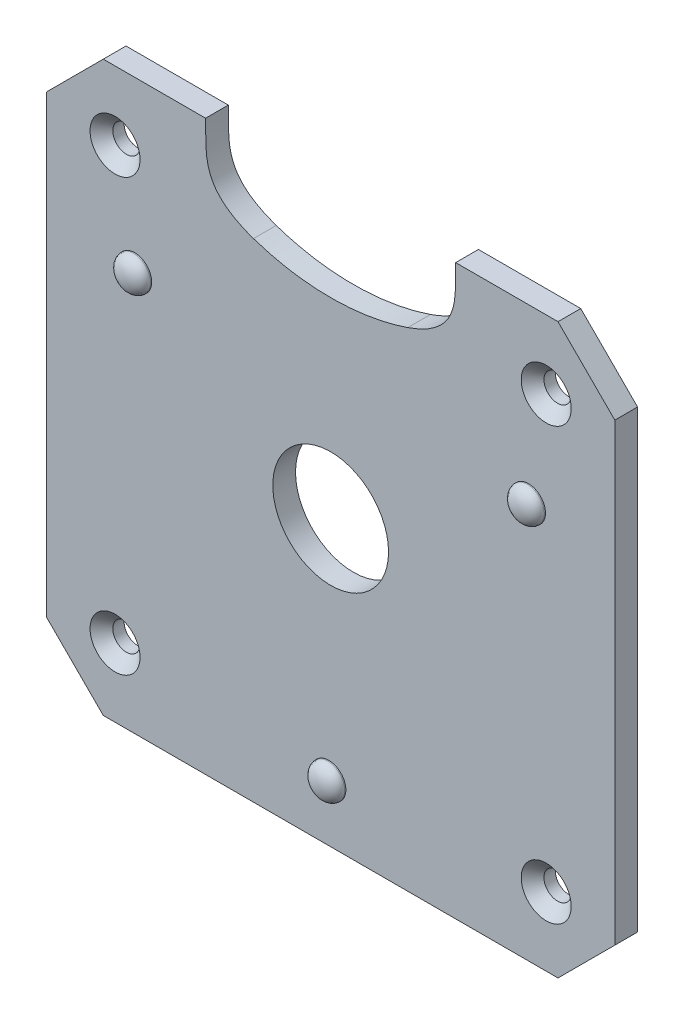
ISO-10303-21;
HEADER;
FILE_DESCRIPTION(('STEP AP214'),'2;1');
FILE_NAME('part.step','',(''),(''),'','','');
FILE_SCHEMA(('AUTOMOTIVE_DESIGN { 1 0 10303 214 1 1 1 1 }'));
ENDSEC;
DATA;
#1=APPLICATION_CONTEXT('core data for automotive mechanical design processes');
#2=APPLICATION_PROTOCOL_DEFINITION('international standard','automotive_design',2000,#1);
#3=PRODUCT_CONTEXT('',#1,'mechanical');
#4=PRODUCT('Part','Part','',(#3));
#5=PRODUCT_RELATED_PRODUCT_CATEGORY('part','',(#4));
#6=PRODUCT_DEFINITION_FORMATION('','',#4);
#7=PRODUCT_DEFINITION_CONTEXT('part definition',#1,'design');
#8=PRODUCT_DEFINITION('design','',#6,#7);
#9=PRODUCT_DEFINITION_SHAPE('','',#8);
#10=(LENGTH_UNIT() NAMED_UNIT(*) SI_UNIT(.MILLI.,.METRE.));
#11=(NAMED_UNIT(*) PLANE_ANGLE_UNIT() SI_UNIT($,.RADIAN.));
#12=(NAMED_UNIT(*) SI_UNIT($,.STERADIAN.) SOLID_ANGLE_UNIT());
#13=UNCERTAINTY_MEASURE_WITH_UNIT(LENGTH_MEASURE(1.E-05),#10,'distance_accuracy_value','');
#14=(GEOMETRIC_REPRESENTATION_CONTEXT(3) GLOBAL_UNCERTAINTY_ASSIGNED_CONTEXT((#13)) GLOBAL_UNIT_ASSIGNED_CONTEXT((#10,
#11,#12)) REPRESENTATION_CONTEXT('',''));
#15=CARTESIAN_POINT('',(0.,0.,0.));
#16=DIRECTION('',(0.,0.,1.));
#17=DIRECTION('',(1.,0.,0.));
#18=AXIS2_PLACEMENT_3D('',#15,#16,#17);
#19=CARTESIAN_POINT('',(28.6297219635711,40.1216218048315,2.));
#20=DIRECTION('',(0.,0.,-1.));
#21=DIRECTION('',(-1.,0.,0.));
#22=AXIS2_PLACEMENT_3D('',#19,#20,#21);
#23=PLANE('',#22);
#24=CARTESIAN_POINT('',(0.984735108088851,29.7281951951246,2.));
#25=DIRECTION('',(0.,0.,-1.));
#26=DIRECTION('',(-1.,0.,0.));
#27=AXIS2_PLACEMENT_3D('',#24,#25,#26);
#28=CIRCLE('',#27,1.50000000009049);
#29=CARTESIAN_POINT('',(-0.51526489200164,29.7281951951246,2.));
#30=VERTEX_POINT('',#29);
#31=EDGE_CURVE('E12',#30,#30,#28,.F.);
#32=ORIENTED_EDGE('',*,*,#31,.F.);
#33=EDGE_LOOP('',(#32));
#34=FACE_BOUND('',#33,.T.);
#35=CARTESIAN_POINT('',(35.6257512594659,29.4534524356945,2.));
#36=DIRECTION('',(0.,0.,-1.));
#37=DIRECTION('',(-1.,0.,0.));
#38=AXIS2_PLACEMENT_3D('',#35,#36,#37);
#39=CIRCLE('',#38,1.50000000002545);
#40=CARTESIAN_POINT('',(34.1257512594405,29.4534524356945,2.));
#41=VERTEX_POINT('',#40);
#42=EDGE_CURVE('E48',#41,#41,#39,.F.);
#43=ORIENTED_EDGE('',*,*,#42,.F.);
#44=EDGE_LOOP('',(#43));
#45=FACE_BOUND('',#44,.T.);
#46=CARTESIAN_POINT('',(18.0673089746051,-0.409176184590083,2.));
#47=DIRECTION('',(0.,0.,-1.));
#48=DIRECTION('',(-1.,0.,0.));
#49=AXIS2_PLACEMENT_3D('',#46,#47,#48);
#50=CIRCLE('',#49,1.49999999988169);
#51=CARTESIAN_POINT('',(16.5673089747234,-0.409176184590083,2.));
#52=VERTEX_POINT('',#51);
#53=EDGE_CURVE('E158',#52,#52,#50,.F.);
#54=ORIENTED_EDGE('',*,*,#53,.F.);
#55=EDGE_LOOP('',(#54));
#56=FACE_BOUND('',#55,.T.);
#57=CARTESIAN_POINT('',(-0.738534313334639,38.5552899094894,2.));
#58=DIRECTION('',(0.,0.,1.));
#59=DIRECTION('',(1.,0.,0.));
#60=AXIS2_PLACEMENT_3D('',#57,#58,#59);
#61=CIRCLE('',#60,2.2);
#62=CARTESIAN_POINT('',(1.46146568666536,38.5552899094894,2.));
#63=VERTEX_POINT('',#62);
#64=EDGE_CURVE('E335',#63,#63,#61,.T.);
#65=ORIENTED_EDGE('',*,*,#64,.F.);
#66=EDGE_LOOP('',(#65));
#67=FACE_BOUND('',#66,.T.);
#68=CARTESIAN_POINT('',(37.190397874776,38.5552899094894,2.));
#69=DIRECTION('',(0.,0.,1.));
#70=DIRECTION('',(1.,0.,0.));
#71=AXIS2_PLACEMENT_3D('',#68,#69,#70);
#72=CIRCLE('',#71,2.2);
#73=CARTESIAN_POINT('',(39.390397874776,38.5552899094894,2.));
#74=VERTEX_POINT('',#73);
#75=EDGE_CURVE('E336',#74,#74,#72,.T.);
#76=ORIENTED_EDGE('',*,*,#75,.F.);
#77=EDGE_LOOP('',(#76));
#78=FACE_BOUND('',#77,.T.);
#79=CARTESIAN_POINT('',(37.1903978747583,0.626357721336686,2.));
#80=DIRECTION('',(0.,0.,1.));
#81=DIRECTION('',(1.,0.,0.));
#82=AXIS2_PLACEMENT_3D('',#79,#80,#81);
#83=CIRCLE('',#82,2.2);
#84=CARTESIAN_POINT('',(39.3903978747583,0.626357721336686,2.));
#85=VERTEX_POINT('',#84);
#86=EDGE_CURVE('E344',#85,#85,#83,.T.);
#87=ORIENTED_EDGE('',*,*,#86,.F.);
#88=EDGE_LOOP('',(#87));
#89=FACE_BOUND('',#88,.T.);
#90=CARTESIAN_POINT('',(18.2286892247496,19.5908244754107,2.));
#91=DIRECTION('',(0.,0.,1.));
#92=DIRECTION('',(1.,0.,0.));
#93=AXIS2_PLACEMENT_3D('',#90,#91,#92);
#94=CIRCLE('',#93,5.09116882454314);
#95=CARTESIAN_POINT('',(23.3198580492927,19.5908244754107,2.));
#96=VERTEX_POINT('',#95);
#97=EDGE_CURVE('E262',#96,#96,#94,.T.);
#98=ORIENTED_EDGE('',*,*,#97,.F.);
#99=EDGE_LOOP('',(#98));
#100=FACE_BOUND('',#99,.T.);
#101=DIRECTION('',(1.,0.,0.));
#102=VECTOR('',#101,1.);
#103=CARTESIAN_POINT('',(-1.77406821927926,-5.40917618459008,2.));
#104=LINE('',#103,#102);
#105=CARTESIAN_POINT('',(-1.77406821927926,-5.40917618459008,2.));
#106=VERTEX_POINT('',#105);
#107=CARTESIAN_POINT('',(38.2259317807207,-5.4091761845898,2.));
#108=VERTEX_POINT('',#107);
#109=EDGE_CURVE('E144',#106,#108,#104,.T.);
#110=ORIENTED_EDGE('',*,*,#109,.T.);
#111=DIRECTION('',(0.707106781186545,0.70710678118655,0.));
#112=VECTOR('',#111,1.);
#113=CARTESIAN_POINT('',(38.2259317807207,-5.4091761845898,2.));
#114=LINE('',#113,#112);
#115=CARTESIAN_POINT('',(43.2259317807207,-0.409176184589764,2.));
#116=VERTEX_POINT('',#115);
#117=EDGE_CURVE('E133',#108,#116,#114,.T.);
#118=ORIENTED_EDGE('',*,*,#117,.T.);
#119=DIRECTION('',(0.,1.,0.));
#120=VECTOR('',#119,1.);
#121=CARTESIAN_POINT('',(43.2259317807207,-0.409176184589764,2.));
#122=LINE('',#121,#120);
#123=CARTESIAN_POINT('',(43.2259317807204,39.5908238154102,2.));
#124=VERTEX_POINT('',#123);
#125=EDGE_CURVE('E143',#116,#124,#122,.T.);
#126=ORIENTED_EDGE('',*,*,#125,.T.);
#127=DIRECTION('',(-0.707106781184893,0.707106781188202,0.));
#128=VECTOR('',#127,1.);
#129=CARTESIAN_POINT('',(43.2259317807204,39.5908238154102,2.));
#130=LINE('',#129,#128);
#131=CARTESIAN_POINT('',(38.2259317807203,44.5908238154337,2.));
#132=VERTEX_POINT('',#131);
#133=EDGE_CURVE('E296',#124,#132,#130,.T.);
#134=ORIENTED_EDGE('',*,*,#133,.T.);
#135=DIRECTION('',(-1.,0.,0.));
#136=VECTOR('',#135,1.);
#137=CARTESIAN_POINT('',(38.2259317807203,44.5908238154337,2.));
#138=LINE('',#137,#136);
#139=CARTESIAN_POINT('',(29.2259317807203,44.5908238154337,2.));
#140=VERTEX_POINT('',#139);
#141=EDGE_CURVE('E410',#132,#140,#138,.T.);
#142=ORIENTED_EDGE('',*,*,#141,.T.);
#143=CARTESIAN_POINT('',(25.0097779651742,37.5289151096982,2.));
#144=CARTESIAN_POINT('',(25.3698908521602,37.65237198655,2.));
#145=CARTESIAN_POINT('',(25.7240517626397,37.7916511060342,2.));
#146=CARTESIAN_POINT('',(26.4097431584287,38.1097334149871,2.));
#147=CARTESIAN_POINT('',(26.7421515289191,38.2885749516192,2.));
#148=CARTESIAN_POINT('',(27.3766302729235,38.7038114493102,2.));
#149=CARTESIAN_POINT('',(27.6796796901699,38.9421439167601,2.));
#150=CARTESIAN_POINT('',(28.0795366385897,39.3463061282389,2.));
#151=CARTESIAN_POINT('',(28.2044298936651,39.4892854245338,2.));
#152=CARTESIAN_POINT('',(28.4346969304901,39.7944522093401,2.));
#153=CARTESIAN_POINT('',(28.5389113949887,39.9555434891672,2.));
#154=CARTESIAN_POINT('',(28.7205325321534,40.2877001204959,2.));
#155=CARTESIAN_POINT('',(28.798713692026,40.4597767165256,2.));
#156=CARTESIAN_POINT('',(28.9314228362042,40.8151638770033,2.));
#157=CARTESIAN_POINT('',(28.9861563388135,40.9996495821849,2.));
#158=CARTESIAN_POINT('',(29.1171773826498,41.5558863921744,2.));
#159=CARTESIAN_POINT('',(29.1621524173123,41.931869130643,2.));
#160=CARTESIAN_POINT('',(29.2137314794168,42.6885057049873,2.));
#161=CARTESIAN_POINT('',(29.2206269087092,43.0693179359305,2.));
#162=CARTESIAN_POINT('',(29.2267313608473,43.8300502556528,2.));
#163=CARTESIAN_POINT('',(29.2259317807203,44.210439423621,2.));
#164=CARTESIAN_POINT('',(29.2259317807203,44.5908238154337,2.));
#165=B_SPLINE_CURVE_WITH_KNOTS('',3,(#143,#144,#145,#146,#147,#148,#149,#150,#151,#152,#153,
#154,#155,#156,#157,#158,#159,#160,#161,#162,#163,#164),.UNSPECIFIED.,.F.,.F.,(4,2,2,2,2,2,2,2,
2,2,4),(0.,0.125,0.250000000000001,0.375000000000001,0.437500000000001,0.500000000000001,
0.562500000000001,0.625000000000001,0.750000000000001,0.875,1.),.UNSPECIFIED.);
#166=CARTESIAN_POINT('',(25.0097779651742,37.5289151096982,2.));
#167=VERTEX_POINT('',#166);
#168=EDGE_CURVE('E411',#140,#167,#165,.F.);
#169=ORIENTED_EDGE('',*,*,#168,.T.);
#170=CARTESIAN_POINT('',(11.4420855962665,37.5289151096983,2.));
#171=CARTESIAN_POINT('',(12.5381254539251,37.153161665093,2.));
#172=CARTESIAN_POINT('',(13.6559160084676,36.8790997201959,2.));
#173=CARTESIAN_POINT('',(15.3613603735311,36.602462190242,2.));
#174=CARTESIAN_POINT('',(15.9366292827911,36.5332549641711,2.));
#175=CARTESIAN_POINT('',(17.0881755702268,36.4418250634013,2.));
#176=CARTESIAN_POINT('',(17.6622981324373,36.4195436568266,2.));
#177=CARTESIAN_POINT('',(19.3799080134636,36.4202466897503,2.));
#178=CARTESIAN_POINT('',(20.5186809124968,36.5101624271123,2.));
#179=CARTESIAN_POINT('',(22.7830854716196,36.8765619671758,2.));
#180=CARTESIAN_POINT('',(23.9137358622169,37.1531608953414,2.));
#181=CARTESIAN_POINT('',(25.0097779651742,37.5289151096982,2.));
#182=B_SPLINE_CURVE_WITH_KNOTS('',3,(#170,#171,#172,#173,#174,#175,#176,#177,#178,#179,#180,
#181),.UNSPECIFIED.,.F.,.F.,(4,2,2,2,2,4),(0.,0.25,0.375,0.499999999999999,0.75,1.),.UNSPECIFIED.);
#183=CARTESIAN_POINT('',(11.4420855962665,37.5289151096983,2.));
#184=VERTEX_POINT('',#183);
#185=EDGE_CURVE('E209',#167,#184,#182,.F.);
#186=ORIENTED_EDGE('',*,*,#185,.T.);
#187=CARTESIAN_POINT('',(7.22593178072035,44.5908238154097,2.));
#188=CARTESIAN_POINT('',(7.22593178072036,44.2117585478557,2.));
#189=CARTESIAN_POINT('',(7.22514479217583,43.8326477446905,2.));
#190=CARTESIAN_POINT('',(7.23115906194766,43.074865198883,2.));
#191=CARTESIAN_POINT('',(7.23790432328141,42.6961902162451,2.));
#192=CARTESIAN_POINT('',(7.28879884293664,41.9410044689451,2.));
#193=CARTESIAN_POINT('',(7.33309416654868,41.5645021557093,2.));
#194=CARTESIAN_POINT('',(7.50841314165779,40.8165156829468,2.));
#195=CARTESIAN_POINT('',(7.63781066804623,40.4596659485503,2.));
#196=CARTESIAN_POINT('',(7.91105995055382,39.9585464393027,2.));
#197=CARTESIAN_POINT('',(8.01622909028249,39.7958358924644,2.));
#198=CARTESIAN_POINT('',(8.24621980687626,39.4907542508424,2.));
#199=CARTESIAN_POINT('',(8.37112507038859,39.3476049751704,2.));
#200=CARTESIAN_POINT('',(8.77159898212958,38.9425679323875,2.));
#201=CARTESIAN_POINT('',(9.07605662421048,38.7031765001301,2.));
#202=CARTESIAN_POINT('',(9.71121154570716,38.2876900576583,2.));
#203=CARTESIAN_POINT('',(10.0436182442269,38.1089796949889,2.));
#204=CARTESIAN_POINT('',(10.7287237762749,37.7912871535794,2.));
#205=CARTESIAN_POINT('',(11.0815337099056,37.652522487945,2.));
#206=CARTESIAN_POINT('',(11.4420855962665,37.5289151096983,2.));
#207=B_SPLINE_CURVE_WITH_KNOTS('',3,(#187,#188,#189,#190,#191,#192,#193,#194,#195,#196,#197,
#198,#199,#200,#201,#202,#203,#204,#205,#206),.UNSPECIFIED.,.F.,.F.,(4,2,2,2,2,2,2,2,2,4),(0.,
0.125,0.25,0.375000000000001,0.500000000000001,0.562500000000001,0.625000000000001,
0.750000000000001,0.875,1.),.UNSPECIFIED.);
#208=CARTESIAN_POINT('',(7.22593178072035,44.59082381541,2.));
#209=VERTEX_POINT('',#208);
#210=EDGE_CURVE('E168',#184,#209,#207,.F.);
#211=ORIENTED_EDGE('',*,*,#210,.T.);
#212=DIRECTION('',(-1.,0.,0.));
#213=VECTOR('',#212,1.);
#214=CARTESIAN_POINT('',(7.22593178072035,44.59082381541,2.));
#215=LINE('',#214,#213);
#216=CARTESIAN_POINT('',(-1.77406821927962,44.5908238154099,2.));
#217=VERTEX_POINT('',#216);
#218=EDGE_CURVE('E256',#209,#217,#215,.T.);
#219=ORIENTED_EDGE('',*,*,#218,.T.);
#220=DIRECTION('',(-0.707106781186543,-0.707106781186553,0.));
#221=VECTOR('',#220,1.);
#222=CARTESIAN_POINT('',(-1.77406821927962,44.5908238154099,2.));
#223=LINE('',#222,#221);
#224=CARTESIAN_POINT('',(-6.77406821927962,39.5908238154099,2.));
#225=VERTEX_POINT('',#224);
#226=EDGE_CURVE('E250',#217,#225,#223,.T.);
#227=ORIENTED_EDGE('',*,*,#226,.T.);
#228=DIRECTION('',(0.,-1.,0.));
#229=VECTOR('',#228,1.);
#230=CARTESIAN_POINT('',(-6.77406821927962,39.5908238154099,2.));
#231=LINE('',#230,#229);
#232=CARTESIAN_POINT('',(-6.77406821927933,-0.409176184590083,2.));
#233=VERTEX_POINT('',#232);
#234=EDGE_CURVE('E255',#225,#233,#231,.T.);
#235=ORIENTED_EDGE('',*,*,#234,.T.);
#236=DIRECTION('',(0.707106781186553,-0.707106781186542,0.));
#237=VECTOR('',#236,1.);
#238=CARTESIAN_POINT('',(-6.77406821927933,-0.409176184590083,2.));
#239=LINE('',#238,#237);
#240=EDGE_CURVE('E149',#233,#106,#239,.T.);
#241=ORIENTED_EDGE('',*,*,#240,.T.);
#242=EDGE_LOOP('',(#110,#118,#126,#134,#142,#169,#186,#211,#219,#227,#235,#241));
#243=FACE_BOUND('',#242,.T.);
#244=CARTESIAN_POINT('',(-0.738534313334635,0.626357721331051,2.));
#245=DIRECTION('',(0.,0.,1.));
#246=DIRECTION('',(1.,0.,0.));
#247=AXIS2_PLACEMENT_3D('',#244,#245,#246);
#248=CIRCLE('',#247,2.2);
#249=CARTESIAN_POINT('',(1.46146568666537,0.626357721331051,2.));
#250=VERTEX_POINT('',#249);
#251=EDGE_CURVE('E354',#250,#250,#248,.T.);
#252=ORIENTED_EDGE('',*,*,#251,.F.);
#253=EDGE_LOOP('',(#252));
#254=FACE_BOUND('',#253,.T.);
#255=ADVANCED_FACE('F39',(#34,#45,#56,#67,#78,#89,#100,#243,#254),#23,.F.);
#256=CARTESIAN_POINT('',(-1.77406821927926,-5.40917618459008,2.));
#257=DIRECTION('',(0.,1.,0.));
#258=DIRECTION('',(-1.,0.,0.));
#259=AXIS2_PLACEMENT_3D('',#256,#257,#258);
#260=PLANE('',#259);
#261=DIRECTION('',(1.,0.,0.));
#262=VECTOR('',#261,1.);
#263=CARTESIAN_POINT('',(-1.77406821927926,-5.40917618459008,0.));
#264=LINE('',#263,#262);
#265=CARTESIAN_POINT('',(-1.77406821927926,-5.40917618459008,0.));
#266=VERTEX_POINT('',#265);
#267=CARTESIAN_POINT('',(38.2259317807207,-5.4091761845898,0.));
#268=VERTEX_POINT('',#267);
#269=EDGE_CURVE('E157',#266,#268,#264,.T.);
#270=ORIENTED_EDGE('',*,*,#269,.T.);
#271=DIRECTION('',(0.,0.,-1.));
#272=VECTOR('',#271,1.);
#273=CARTESIAN_POINT('',(38.2259317807207,-5.4091761845898,2.));
#274=LINE('',#273,#272);
#275=EDGE_CURVE('E137',#108,#268,#274,.T.);
#276=ORIENTED_EDGE('',*,*,#275,.F.);
#277=ORIENTED_EDGE('',*,*,#109,.F.);
#278=DIRECTION('',(0.,0.,-1.));
#279=VECTOR('',#278,1.);
#280=CARTESIAN_POINT('',(-1.77406821927926,-5.40917618459008,2.));
#281=LINE('',#280,#279);
#282=EDGE_CURVE('E259',#106,#266,#281,.T.);
#283=ORIENTED_EDGE('',*,*,#282,.T.);
#284=EDGE_LOOP('',(#270,#276,#277,#283));
#285=FACE_BOUND('',#284,.T.);
#286=ADVANCED_FACE('F155',(#285),#260,.F.);
#287=CARTESIAN_POINT('',(38.2259317807207,-5.4091761845898,2.));
#288=DIRECTION('',(-0.70710678118655,0.707106781186545,0.));
#289=DIRECTION('',(-0.707106781186545,-0.70710678118655,0.));
#290=AXIS2_PLACEMENT_3D('',#287,#288,#289);
#291=PLANE('',#290);
#292=DIRECTION('',(0.707106781186545,0.70710678118655,0.));
#293=VECTOR('',#292,1.);
#294=CARTESIAN_POINT('',(38.2259317807207,-5.4091761845898,0.));
#295=LINE('',#294,#293);
#296=CARTESIAN_POINT('',(43.2259317807207,-0.409176184589764,0.));
#297=VERTEX_POINT('',#296);
#298=EDGE_CURVE('E261',#268,#297,#295,.T.);
#299=ORIENTED_EDGE('',*,*,#298,.T.);
#300=DIRECTION('',(0.,0.,-1.));
#301=VECTOR('',#300,1.);
#302=CARTESIAN_POINT('',(43.2259317807207,-0.409176184589764,2.));
#303=LINE('',#302,#301);
#304=EDGE_CURVE('E140',#116,#297,#303,.T.);
#305=ORIENTED_EDGE('',*,*,#304,.F.);
#306=ORIENTED_EDGE('',*,*,#117,.F.);
#307=ORIENTED_EDGE('',*,*,#275,.T.);
#308=EDGE_LOOP('',(#299,#305,#306,#307));
#309=FACE_BOUND('',#308,.T.);
#310=ADVANCED_FACE('F135',(#309),#291,.F.);
#311=CARTESIAN_POINT('',(43.2259317807207,-0.409176184589764,2.));
#312=DIRECTION('',(-1.,0.,0.));
#313=DIRECTION('',(0.,-1.,0.));
#314=AXIS2_PLACEMENT_3D('',#311,#312,#313);
#315=PLANE('',#314);
#316=DIRECTION('',(0.,1.,0.));
#317=VECTOR('',#316,1.);
#318=CARTESIAN_POINT('',(43.2259317807207,-0.409176184589764,0.));
#319=LINE('',#318,#317);
#320=CARTESIAN_POINT('',(43.2259317807204,39.5908238154102,0.));
#321=VERTEX_POINT('',#320);
#322=EDGE_CURVE('E264',#297,#321,#319,.T.);
#323=ORIENTED_EDGE('',*,*,#322,.T.);
#324=DIRECTION('',(0.,0.,-1.));
#325=VECTOR('',#324,1.);
#326=CARTESIAN_POINT('',(43.2259317807204,39.5908238154102,2.));
#327=LINE('',#326,#325);
#328=EDGE_CURVE('E162',#124,#321,#327,.T.);
#329=ORIENTED_EDGE('',*,*,#328,.F.);
#330=ORIENTED_EDGE('',*,*,#125,.F.);
#331=ORIENTED_EDGE('',*,*,#304,.T.);
#332=EDGE_LOOP('',(#323,#329,#330,#331));
#333=FACE_BOUND('',#332,.T.);
#334=ADVANCED_FACE('F507',(#333),#315,.F.);
#335=CARTESIAN_POINT('',(43.2259317807204,39.5908238154102,2.));
#336=DIRECTION('',(-0.707106781188202,-0.707106781184893,0.));
#337=DIRECTION('',(0.707106781184893,-0.707106781188202,0.));
#338=AXIS2_PLACEMENT_3D('',#335,#336,#337);
#339=PLANE('',#338);
#340=DIRECTION('',(-0.707106781184893,0.707106781188202,0.));
#341=VECTOR('',#340,1.);
#342=CARTESIAN_POINT('',(43.2259317807204,39.5908238154102,0.));
#343=LINE('',#342,#341);
#344=CARTESIAN_POINT('',(38.2259317807203,44.5908238154337,0.));
#345=VERTEX_POINT('',#344);
#346=EDGE_CURVE('E266',#321,#345,#343,.T.);
#347=ORIENTED_EDGE('',*,*,#346,.T.);
#348=DIRECTION('',(0.,0.,-1.));
#349=VECTOR('',#348,1.);
#350=CARTESIAN_POINT('',(38.2259317807203,44.5908238154337,2.));
#351=LINE('',#350,#349);
#352=EDGE_CURVE('E286',#132,#345,#351,.T.);
#353=ORIENTED_EDGE('',*,*,#352,.F.);
#354=ORIENTED_EDGE('',*,*,#133,.F.);
#355=ORIENTED_EDGE('',*,*,#328,.T.);
#356=EDGE_LOOP('',(#347,#353,#354,#355));
#357=FACE_BOUND('',#356,.T.);
#358=ADVANCED_FACE('F294',(#357),#339,.F.);
#359=CARTESIAN_POINT('',(38.2259317807203,44.5908238154337,2.));
#360=DIRECTION('',(0.,-1.,0.));
#361=DIRECTION('',(0.,0.,-1.));
#362=AXIS2_PLACEMENT_3D('',#359,#360,#361);
#363=PLANE('',#362);
#364=DIRECTION('',(-1.,0.,0.));
#365=VECTOR('',#364,1.);
#366=CARTESIAN_POINT('',(38.2259317807203,44.5908238154337,0.));
#367=LINE('',#366,#365);
#368=CARTESIAN_POINT('',(29.2259317807203,44.5908238154337,0.));
#369=VERTEX_POINT('',#368);
#370=EDGE_CURVE('E268',#345,#369,#367,.T.);
#371=ORIENTED_EDGE('',*,*,#370,.T.);
#372=DIRECTION('',(0.,0.,-1.));
#373=VECTOR('',#372,1.);
#374=CARTESIAN_POINT('',(29.2259317807203,44.5908238154337,2.));
#375=LINE('',#374,#373);
#376=EDGE_CURVE('E288',#140,#369,#375,.T.);
#377=ORIENTED_EDGE('',*,*,#376,.F.);
#378=ORIENTED_EDGE('',*,*,#141,.F.);
#379=ORIENTED_EDGE('',*,*,#352,.T.);
#380=EDGE_LOOP('',(#371,#377,#378,#379));
#381=FACE_BOUND('',#380,.T.);
#382=ADVANCED_FACE('F514',(#381),#363,.F.);
#383=CARTESIAN_POINT('',(29.2259317807203,44.5908238154337,2.));
#384=CARTESIAN_POINT('',(29.2259317807203,44.210439423621,2.));
#385=CARTESIAN_POINT('',(29.2267313608473,43.8300502556528,2.));
#386=CARTESIAN_POINT('',(29.2206269087092,43.0693179359305,2.));
#387=CARTESIAN_POINT('',(29.2137314794168,42.6885057049873,2.));
#388=CARTESIAN_POINT('',(29.1621524173123,41.931869130643,2.));
#389=CARTESIAN_POINT('',(29.1171773826498,41.5558863921744,2.));
#390=CARTESIAN_POINT('',(28.9861563388135,40.9996495821849,2.));
#391=CARTESIAN_POINT('',(28.9314228362042,40.8151638770033,2.));
#392=CARTESIAN_POINT('',(28.798713692026,40.4597767165256,2.));
#393=CARTESIAN_POINT('',(28.7205325321534,40.2877001204959,2.));
#394=CARTESIAN_POINT('',(28.5389113949887,39.9555434891672,2.));
#395=CARTESIAN_POINT('',(28.4346969304901,39.7944522093401,2.));
#396=CARTESIAN_POINT('',(28.2044298936651,39.4892854245338,2.));
#397=CARTESIAN_POINT('',(28.0795366385897,39.3463061282389,2.));
#398=CARTESIAN_POINT('',(27.6796796901699,38.9421439167601,2.));
#399=CARTESIAN_POINT('',(27.3766302729235,38.7038114493102,2.));
#400=CARTESIAN_POINT('',(26.7421515289191,38.2885749516192,2.));
#401=CARTESIAN_POINT('',(26.4097431584287,38.1097334149871,2.));
#402=CARTESIAN_POINT('',(25.7240517626397,37.7916511060342,2.));
#403=CARTESIAN_POINT('',(25.3698908521602,37.65237198655,2.));
#404=CARTESIAN_POINT('',(25.0097779651742,37.5289151096982,2.));
#405=B_SPLINE_CURVE_WITH_KNOTS('',3,(#383,#384,#385,#386,#387,#388,#389,#390,#391,#392,#393,
#394,#395,#396,#397,#398,#399,#400,#401,#402,#403,#404),.UNSPECIFIED.,.F.,.F.,(4,2,2,2,2,2,2,2,
2,2,4),(0.,0.125,0.249999999999999,0.374999999999999,0.437499999999999,0.499999999999999,
0.562499999999999,0.624999999999999,0.749999999999999,0.875,1.),.UNSPECIFIED.);
#406=DIRECTION('',(0.,0.,-1.));
#407=VECTOR('',#406,1.);
#408=SURFACE_OF_LINEAR_EXTRUSION('',#405,#407);
#409=CARTESIAN_POINT('',(29.2259317807203,44.5908238154337,0.));
#410=CARTESIAN_POINT('',(29.2259317807203,44.210439423621,0.));
#411=CARTESIAN_POINT('',(29.2267313608473,43.8300502556528,0.));
#412=CARTESIAN_POINT('',(29.2206269087092,43.0693179359305,0.));
#413=CARTESIAN_POINT('',(29.2137314794168,42.6885057049873,0.));
#414=CARTESIAN_POINT('',(29.1621524173123,41.931869130643,0.));
#415=CARTESIAN_POINT('',(29.1171773826498,41.5558863921744,0.));
#416=CARTESIAN_POINT('',(28.9861563388135,40.9996495821849,0.));
#417=CARTESIAN_POINT('',(28.9314228362042,40.8151638770033,0.));
#418=CARTESIAN_POINT('',(28.798713692026,40.4597767165256,0.));
#419=CARTESIAN_POINT('',(28.7205325321534,40.2877001204959,0.));
#420=CARTESIAN_POINT('',(28.5389113949887,39.9555434891672,0.));
#421=CARTESIAN_POINT('',(28.4346969304901,39.7944522093401,0.));
#422=CARTESIAN_POINT('',(28.2044298936651,39.4892854245338,0.));
#423=CARTESIAN_POINT('',(28.0795366385897,39.3463061282389,0.));
#424=CARTESIAN_POINT('',(27.6796796901699,38.9421439167601,0.));
#425=CARTESIAN_POINT('',(27.3766302729235,38.7038114493102,0.));
#426=CARTESIAN_POINT('',(26.7421515289191,38.2885749516192,0.));
#427=CARTESIAN_POINT('',(26.4097431584287,38.1097334149871,0.));
#428=CARTESIAN_POINT('',(25.7240517626397,37.7916511060342,0.));
#429=CARTESIAN_POINT('',(25.3698908521602,37.65237198655,0.));
#430=CARTESIAN_POINT('',(25.0097779651742,37.5289151096982,0.));
#431=B_SPLINE_CURVE_WITH_KNOTS('',3,(#409,#410,#411,#412,#413,#414,#415,#416,#417,#418,#419,
#420,#421,#422,#423,#424,#425,#426,#427,#428,#429,#430),.UNSPECIFIED.,.F.,.F.,(4,2,2,2,2,2,2,2,
2,2,4),(0.,0.125,0.249999999999999,0.374999999999999,0.437499999999999,0.499999999999999,
0.562499999999999,0.624999999999999,0.749999999999999,0.875,1.),.UNSPECIFIED.);
#432=CARTESIAN_POINT('',(25.0097779651742,37.5289151096982,0.));
#433=VERTEX_POINT('',#432);
#434=EDGE_CURVE('E303',#369,#433,#431,.T.);
#435=ORIENTED_EDGE('',*,*,#434,.T.);
#436=DIRECTION('',(0.,0.,-1.));
#437=VECTOR('',#436,1.);
#438=CARTESIAN_POINT('',(25.0097779651742,37.5289151096982,2.));
#439=LINE('',#438,#437);
#440=EDGE_CURVE('E214',#167,#433,#439,.T.);
#441=ORIENTED_EDGE('',*,*,#440,.F.);
#442=ORIENTED_EDGE('',*,*,#168,.F.);
#443=ORIENTED_EDGE('',*,*,#376,.T.);
#444=EDGE_LOOP('',(#435,#441,#442,#443));
#445=FACE_BOUND('',#444,.T.);
#446=ADVANCED_FACE('F228',(#445),#408,.F.);
#447=CARTESIAN_POINT('',(25.0097779651742,37.5289151096982,2.));
#448=CARTESIAN_POINT('',(23.9137358622169,37.1531608953414,2.));
#449=CARTESIAN_POINT('',(22.7830854716196,36.8765619671758,2.));
#450=CARTESIAN_POINT('',(20.5186809124968,36.5101624271123,2.));
#451=CARTESIAN_POINT('',(19.3799080134636,36.4202466897503,2.));
#452=CARTESIAN_POINT('',(17.6622981324373,36.4195436568266,2.));
#453=CARTESIAN_POINT('',(17.0881755702268,36.4418250634013,2.));
#454=CARTESIAN_POINT('',(15.9366292827911,36.5332549641711,2.));
#455=CARTESIAN_POINT('',(15.3613603735311,36.602462190242,2.));
#456=CARTESIAN_POINT('',(13.6559160084676,36.8790997201959,2.));
#457=CARTESIAN_POINT('',(12.5381254539251,37.153161665093,2.));
#458=CARTESIAN_POINT('',(11.4420855962665,37.5289151096983,2.));
#459=B_SPLINE_CURVE_WITH_KNOTS('',3,(#447,#448,#449,#450,#451,#452,#453,#454,#455,#456,#457,
#458),.UNSPECIFIED.,.F.,.F.,(4,2,2,2,2,4),(0.,0.25,0.500000000000001,0.625,0.75,1.),.UNSPECIFIED.);
#460=DIRECTION('',(0.,0.,-1.));
#461=VECTOR('',#460,1.);
#462=SURFACE_OF_LINEAR_EXTRUSION('',#459,#461);
#463=CARTESIAN_POINT('',(25.0097779651742,37.5289151096982,0.));
#464=CARTESIAN_POINT('',(23.9137358622169,37.1531608953414,0.));
#465=CARTESIAN_POINT('',(22.7830854716196,36.8765619671758,0.));
#466=CARTESIAN_POINT('',(20.5186809124968,36.5101624271123,0.));
#467=CARTESIAN_POINT('',(19.3799080134636,36.4202466897503,0.));
#468=CARTESIAN_POINT('',(17.6622981324373,36.4195436568266,0.));
#469=CARTESIAN_POINT('',(17.0881755702268,36.4418250634013,0.));
#470=CARTESIAN_POINT('',(15.9366292827911,36.5332549641711,0.));
#471=CARTESIAN_POINT('',(15.3613603735311,36.602462190242,0.));
#472=CARTESIAN_POINT('',(13.6559160084676,36.8790997201959,0.));
#473=CARTESIAN_POINT('',(12.5381254539251,37.153161665093,0.));
#474=CARTESIAN_POINT('',(11.4420855962665,37.5289151096983,0.));
#475=B_SPLINE_CURVE_WITH_KNOTS('',3,(#463,#464,#465,#466,#467,#468,#469,#470,#471,#472,#473,
#474),.UNSPECIFIED.,.F.,.F.,(4,2,2,2,2,4),(0.,0.25,0.500000000000001,0.625,0.75,1.),.UNSPECIFIED.);
#476=CARTESIAN_POINT('',(11.4420855962665,37.5289151096983,0.));
#477=VERTEX_POINT('',#476);
#478=EDGE_CURVE('E309',#433,#477,#475,.T.);
#479=ORIENTED_EDGE('',*,*,#478,.T.);
#480=DIRECTION('',(0.,0.,-1.));
#481=VECTOR('',#480,1.);
#482=CARTESIAN_POINT('',(11.4420855962665,37.5289151096983,2.));
#483=LINE('',#482,#481);
#484=EDGE_CURVE('E437',#184,#477,#483,.T.);
#485=ORIENTED_EDGE('',*,*,#484,.F.);
#486=ORIENTED_EDGE('',*,*,#185,.F.);
#487=ORIENTED_EDGE('',*,*,#440,.T.);
#488=EDGE_LOOP('',(#479,#485,#486,#487));
#489=FACE_BOUND('',#488,.T.);
#490=ADVANCED_FACE('F216',(#489),#462,.F.);
#491=CARTESIAN_POINT('',(11.4420855962665,37.5289151096983,2.));
#492=CARTESIAN_POINT('',(11.0815337099056,37.652522487945,2.));
#493=CARTESIAN_POINT('',(10.7287237762749,37.7912871535794,2.));
#494=CARTESIAN_POINT('',(10.0436182442269,38.1089796949889,2.));
#495=CARTESIAN_POINT('',(9.71121154570716,38.2876900576583,2.));
#496=CARTESIAN_POINT('',(9.07605662421048,38.7031765001301,2.));
#497=CARTESIAN_POINT('',(8.77159898212958,38.9425679323875,2.));
#498=CARTESIAN_POINT('',(8.37112507038859,39.3476049751704,2.));
#499=CARTESIAN_POINT('',(8.24621980687626,39.4907542508424,2.));
#500=CARTESIAN_POINT('',(8.01622909028249,39.7958358924644,2.));
#501=CARTESIAN_POINT('',(7.91105995055382,39.9585464393027,2.));
#502=CARTESIAN_POINT('',(7.63781066804623,40.4596659485503,2.));
#503=CARTESIAN_POINT('',(7.50841314165779,40.8165156829468,2.));
#504=CARTESIAN_POINT('',(7.33309416654868,41.5645021557093,2.));
#505=CARTESIAN_POINT('',(7.28879884293664,41.9410044689451,2.));
#506=CARTESIAN_POINT('',(7.23790432328141,42.6961902162451,2.));
#507=CARTESIAN_POINT('',(7.23115906194766,43.074865198883,2.));
#508=CARTESIAN_POINT('',(7.22514479217583,43.8326477446905,2.));
#509=CARTESIAN_POINT('',(7.22593178072036,44.2117585478557,2.));
#510=CARTESIAN_POINT('',(7.22593178072035,44.5908238154097,2.));
#511=B_SPLINE_CURVE_WITH_KNOTS('',3,(#491,#492,#493,#494,#495,#496,#497,#498,#499,#500,#501,
#502,#503,#504,#505,#506,#507,#508,#509,#510),.UNSPECIFIED.,.F.,.F.,(4,2,2,2,2,2,2,2,2,4),(0.,
0.125,0.249999999999999,0.374999999999999,0.437499999999999,0.499999999999999,0.624999999999999,
0.75,0.875,1.),.UNSPECIFIED.);
#512=DIRECTION('',(0.,0.,-1.));
#513=VECTOR('',#512,1.);
#514=SURFACE_OF_LINEAR_EXTRUSION('',#511,#513);
#515=CARTESIAN_POINT('',(11.4420855962665,37.5289151096983,0.));
#516=CARTESIAN_POINT('',(11.0815337099056,37.652522487945,0.));
#517=CARTESIAN_POINT('',(10.7287237762749,37.7912871535794,0.));
#518=CARTESIAN_POINT('',(10.0436182442269,38.1089796949889,0.));
#519=CARTESIAN_POINT('',(9.71121154570716,38.2876900576583,0.));
#520=CARTESIAN_POINT('',(9.07605662421048,38.7031765001301,0.));
#521=CARTESIAN_POINT('',(8.77159898212958,38.9425679323875,0.));
#522=CARTESIAN_POINT('',(8.37112507038859,39.3476049751704,0.));
#523=CARTESIAN_POINT('',(8.24621980687626,39.4907542508424,0.));
#524=CARTESIAN_POINT('',(8.01622909028249,39.7958358924644,0.));
#525=CARTESIAN_POINT('',(7.91105995055382,39.9585464393027,0.));
#526=CARTESIAN_POINT('',(7.63781066804623,40.4596659485503,0.));
#527=CARTESIAN_POINT('',(7.50841314165779,40.8165156829468,0.));
#528=CARTESIAN_POINT('',(7.33309416654868,41.5645021557093,0.));
#529=CARTESIAN_POINT('',(7.28879884293664,41.9410044689451,0.));
#530=CARTESIAN_POINT('',(7.23790432328141,42.6961902162451,0.));
#531=CARTESIAN_POINT('',(7.23115906194766,43.074865198883,0.));
#532=CARTESIAN_POINT('',(7.22514479217583,43.8326477446905,0.));
#533=CARTESIAN_POINT('',(7.22593178072036,44.2117585478557,0.));
#534=CARTESIAN_POINT('',(7.22593178072035,44.5908238154097,0.));
#535=B_SPLINE_CURVE_WITH_KNOTS('',3,(#515,#516,#517,#518,#519,#520,#521,#522,#523,#524,#525,
#526,#527,#528,#529,#530,#531,#532,#533,#534),.UNSPECIFIED.,.F.,.F.,(4,2,2,2,2,2,2,2,2,4),(0.,
0.125,0.249999999999999,0.374999999999999,0.437499999999999,0.499999999999999,0.624999999999999,
0.75,0.875,1.),.UNSPECIFIED.);
#536=CARTESIAN_POINT('',(7.22593178072035,44.59082381541,0.));
#537=VERTEX_POINT('',#536);
#538=EDGE_CURVE('E441',#477,#537,#535,.T.);
#539=ORIENTED_EDGE('',*,*,#538,.T.);
#540=DIRECTION('',(0.,0.,-1.));
#541=VECTOR('',#540,1.);
#542=CARTESIAN_POINT('',(7.22593178072035,44.59082381541,2.));
#543=LINE('',#542,#541);
#544=EDGE_CURVE('E285',#209,#537,#543,.T.);
#545=ORIENTED_EDGE('',*,*,#544,.F.);
#546=ORIENTED_EDGE('',*,*,#210,.F.);
#547=ORIENTED_EDGE('',*,*,#484,.T.);
#548=EDGE_LOOP('',(#539,#545,#546,#547));
#549=FACE_BOUND('',#548,.T.);
#550=ADVANCED_FACE('F227',(#549),#514,.F.);
#551=CARTESIAN_POINT('',(7.22593178072035,44.59082381541,2.));
#552=DIRECTION('',(0.,-1.,0.));
#553=DIRECTION('',(1.,0.,0.));
#554=AXIS2_PLACEMENT_3D('',#551,#552,#553);
#555=PLANE('',#554);
#556=DIRECTION('',(-1.,0.,0.));
#557=VECTOR('',#556,1.);
#558=CARTESIAN_POINT('',(7.22593178072035,44.59082381541,0.));
#559=LINE('',#558,#557);
#560=CARTESIAN_POINT('',(-1.77406821927962,44.5908238154099,0.));
#561=VERTEX_POINT('',#560);
#562=EDGE_CURVE('E272',#537,#561,#559,.T.);
#563=ORIENTED_EDGE('',*,*,#562,.T.);
#564=DIRECTION('',(0.,0.,-1.));
#565=VECTOR('',#564,1.);
#566=CARTESIAN_POINT('',(-1.77406821927962,44.5908238154099,2.));
#567=LINE('',#566,#565);
#568=EDGE_CURVE('E282',#217,#561,#567,.T.);
#569=ORIENTED_EDGE('',*,*,#568,.F.);
#570=ORIENTED_EDGE('',*,*,#218,.F.);
#571=ORIENTED_EDGE('',*,*,#544,.T.);
#572=EDGE_LOOP('',(#563,#569,#570,#571));
#573=FACE_BOUND('',#572,.T.);
#574=ADVANCED_FACE('F493',(#573),#555,.F.);
#575=CARTESIAN_POINT('',(-1.77406821927962,44.5908238154099,2.));
#576=DIRECTION('',(0.707106781186553,-0.707106781186543,0.));
#577=DIRECTION('',(0.707106781186543,0.707106781186553,0.));
#578=AXIS2_PLACEMENT_3D('',#575,#576,#577);
#579=PLANE('',#578);
#580=DIRECTION('',(-0.707106781186543,-0.707106781186553,0.));
#581=VECTOR('',#580,1.);
#582=CARTESIAN_POINT('',(-1.77406821927962,44.5908238154099,0.));
#583=LINE('',#582,#581);
#584=CARTESIAN_POINT('',(-6.77406821927962,39.5908238154099,0.));
#585=VERTEX_POINT('',#584);
#586=EDGE_CURVE('E269',#561,#585,#583,.T.);
#587=ORIENTED_EDGE('',*,*,#586,.T.);
#588=DIRECTION('',(0.,0.,-1.));
#589=VECTOR('',#588,1.);
#590=CARTESIAN_POINT('',(-6.77406821927962,39.5908238154099,2.));
#591=LINE('',#590,#589);
#592=EDGE_CURVE('E279',#225,#585,#591,.T.);
#593=ORIENTED_EDGE('',*,*,#592,.F.);
#594=ORIENTED_EDGE('',*,*,#226,.F.);
#595=ORIENTED_EDGE('',*,*,#568,.T.);
#596=EDGE_LOOP('',(#587,#593,#594,#595));
#597=FACE_BOUND('',#596,.T.);
#598=ADVANCED_FACE('F497',(#597),#579,.F.);
#599=CARTESIAN_POINT('',(-6.77406821927962,39.5908238154099,2.));
#600=DIRECTION('',(1.,0.,0.));
#601=DIRECTION('',(0.,1.,0.));
#602=AXIS2_PLACEMENT_3D('',#599,#600,#601);
#603=PLANE('',#602);
#604=DIRECTION('',(0.,-1.,0.));
#605=VECTOR('',#604,1.);
#606=CARTESIAN_POINT('',(-6.77406821927962,39.5908238154099,0.));
#607=LINE('',#606,#605);
#608=CARTESIAN_POINT('',(-6.77406821927933,-0.409176184590083,0.));
#609=VERTEX_POINT('',#608);
#610=EDGE_CURVE('E271',#585,#609,#607,.T.);
#611=ORIENTED_EDGE('',*,*,#610,.T.);
#612=DIRECTION('',(0.,0.,-1.));
#613=VECTOR('',#612,1.);
#614=CARTESIAN_POINT('',(-6.77406821927933,-0.409176184590083,2.));
#615=LINE('',#614,#613);
#616=EDGE_CURVE('E276',#233,#609,#615,.T.);
#617=ORIENTED_EDGE('',*,*,#616,.F.);
#618=ORIENTED_EDGE('',*,*,#234,.F.);
#619=ORIENTED_EDGE('',*,*,#592,.T.);
#620=EDGE_LOOP('',(#611,#617,#618,#619));
#621=FACE_BOUND('',#620,.T.);
#622=ADVANCED_FACE('F503',(#621),#603,.F.);
#623=CARTESIAN_POINT('',(-6.77406821927933,-0.409176184590083,2.));
#624=DIRECTION('',(0.707106781186542,0.707106781186553,0.));
#625=DIRECTION('',(-0.707106781186553,0.707106781186542,0.));
#626=AXIS2_PLACEMENT_3D('',#623,#624,#625);
#627=PLANE('',#626);
#628=DIRECTION('',(0.707106781186553,-0.707106781186542,0.));
#629=VECTOR('',#628,1.);
#630=CARTESIAN_POINT('',(-6.77406821927933,-0.409176184590083,0.));
#631=LINE('',#630,#629);
#632=EDGE_CURVE('E153',#609,#266,#631,.T.);
#633=ORIENTED_EDGE('',*,*,#632,.T.);
#634=ORIENTED_EDGE('',*,*,#282,.F.);
#635=ORIENTED_EDGE('',*,*,#240,.F.);
#636=ORIENTED_EDGE('',*,*,#616,.T.);
#637=EDGE_LOOP('',(#633,#634,#635,#636));
#638=FACE_BOUND('',#637,.T.);
#639=ADVANCED_FACE('F506',(#638),#627,.F.);
#640=CARTESIAN_POINT('',(28.6297219635711,40.1216218048315,0.));
#641=DIRECTION('',(0.,0.,-1.));
#642=DIRECTION('',(-1.,0.,0.));
#643=AXIS2_PLACEMENT_3D('',#640,#641,#642);
#644=PLANE('',#643);
#645=CARTESIAN_POINT('',(-0.738534313334639,38.5552899094894,0.));
#646=DIRECTION('',(0.,0.,-1.));
#647=DIRECTION('',(-1.,0.,0.));
#648=AXIS2_PLACEMENT_3D('',#645,#646,#647);
#649=CIRCLE('',#648,1.2);
#650=CARTESIAN_POINT('',(-1.93853431333464,38.5552899094894,0.));
#651=VERTEX_POINT('',#650);
#652=EDGE_CURVE('E334',#651,#651,#649,.T.);
#653=ORIENTED_EDGE('',*,*,#652,.F.);
#654=EDGE_LOOP('',(#653));
#655=FACE_BOUND('',#654,.T.);
#656=CARTESIAN_POINT('',(37.190397874776,38.5552899094894,0.));
#657=DIRECTION('',(0.,0.,-1.));
#658=DIRECTION('',(-1.,0.,0.));
#659=AXIS2_PLACEMENT_3D('',#656,#657,#658);
#660=CIRCLE('',#659,1.2);
#661=CARTESIAN_POINT('',(35.990397874776,38.5552899094894,0.));
#662=VERTEX_POINT('',#661);
#663=EDGE_CURVE('E349',#662,#662,#660,.T.);
#664=ORIENTED_EDGE('',*,*,#663,.F.);
#665=EDGE_LOOP('',(#664));
#666=FACE_BOUND('',#665,.T.);
#667=CARTESIAN_POINT('',(37.1903978747583,0.626357721336686,0.));
#668=DIRECTION('',(0.,0.,-1.));
#669=DIRECTION('',(-1.,0.,0.));
#670=AXIS2_PLACEMENT_3D('',#667,#668,#669);
#671=CIRCLE('',#670,1.2);
#672=CARTESIAN_POINT('',(35.9903978747583,0.626357721336686,0.));
#673=VERTEX_POINT('',#672);
#674=EDGE_CURVE('E353',#673,#673,#671,.T.);
#675=ORIENTED_EDGE('',*,*,#674,.F.);
#676=EDGE_LOOP('',(#675));
#677=FACE_BOUND('',#676,.T.);
#678=CARTESIAN_POINT('',(-0.738534313334635,0.626357721331051,0.));
#679=DIRECTION('',(0.,0.,-1.));
#680=DIRECTION('',(-1.,0.,0.));
#681=AXIS2_PLACEMENT_3D('',#678,#679,#680);
#682=CIRCLE('',#681,1.2);
#683=CARTESIAN_POINT('',(-1.93853431333463,0.626357721331051,0.));
#684=VERTEX_POINT('',#683);
#685=EDGE_CURVE('E316',#684,#684,#682,.T.);
#686=ORIENTED_EDGE('',*,*,#685,.F.);
#687=EDGE_LOOP('',(#686));
#688=FACE_BOUND('',#687,.T.);
#689=CARTESIAN_POINT('',(18.2286892247496,19.5908244754107,0.));
#690=DIRECTION('',(0.,0.,-1.));
#691=DIRECTION('',(-1.,0.,0.));
#692=AXIS2_PLACEMENT_3D('',#689,#690,#691);
#693=CIRCLE('',#692,5.09116882454314);
#694=CARTESIAN_POINT('',(13.1375204002064,19.5908244754107,0.));
#695=VERTEX_POINT('',#694);
#696=EDGE_CURVE('E402',#695,#695,#693,.F.);
#697=ORIENTED_EDGE('',*,*,#696,.T.);
#698=EDGE_LOOP('',(#697));
#699=FACE_BOUND('',#698,.T.);
#700=ORIENTED_EDGE('',*,*,#269,.F.);
#701=ORIENTED_EDGE('',*,*,#632,.F.);
#702=ORIENTED_EDGE('',*,*,#610,.F.);
#703=ORIENTED_EDGE('',*,*,#586,.F.);
#704=ORIENTED_EDGE('',*,*,#562,.F.);
#705=ORIENTED_EDGE('',*,*,#538,.F.);
#706=ORIENTED_EDGE('',*,*,#478,.F.);
#707=ORIENTED_EDGE('',*,*,#434,.F.);
#708=ORIENTED_EDGE('',*,*,#370,.F.);
#709=ORIENTED_EDGE('',*,*,#346,.F.);
#710=ORIENTED_EDGE('',*,*,#322,.F.);
#711=ORIENTED_EDGE('',*,*,#298,.F.);
#712=EDGE_LOOP('',(#700,#701,#702,#703,#704,#705,#706,#707,#708,#709,#710,#711));
#713=FACE_BOUND('',#712,.T.);
#714=ADVANCED_FACE('F187',(#655,#666,#677,#688,#699,#713),#644,.T.);
#715=CARTESIAN_POINT('',(18.2286892247496,19.5908244754107,-0.0110000000000002));
#716=DIRECTION('',(0.,0.,1.));
#717=DIRECTION('',(1.,0.,0.));
#718=AXIS2_PLACEMENT_3D('',#715,#716,#717);
#719=CYLINDRICAL_SURFACE('',#718,5.09116882454314);
#720=ORIENTED_EDGE('',*,*,#696,.F.);
#721=EDGE_LOOP('',(#720));
#722=FACE_BOUND('',#721,.T.);
#723=ORIENTED_EDGE('',*,*,#97,.T.);
#724=EDGE_LOOP('',(#723));
#725=FACE_BOUND('',#724,.T.);
#726=ADVANCED_FACE('F185',(#722,#725),#719,.F.);
#727=CARTESIAN_POINT('',(-0.738534313334635,0.626357721331051,2.));
#728=DIRECTION('',(0.,0.,1.));
#729=DIRECTION('',(1.,0.,0.));
#730=AXIS2_PLACEMENT_3D('',#727,#728,#729);
#731=CYLINDRICAL_SURFACE('',#730,1.2);
#732=ORIENTED_EDGE('',*,*,#685,.T.);
#733=EDGE_LOOP('',(#732));
#734=FACE_BOUND('',#733,.T.);
#735=CARTESIAN_POINT('',(-0.738534313334635,0.626357721331051,1.));
#736=DIRECTION('',(0.,0.,1.));
#737=DIRECTION('',(1.,0.,0.));
#738=AXIS2_PLACEMENT_3D('',#735,#736,#737);
#739=CIRCLE('',#738,1.2);
#740=CARTESIAN_POINT('',(0.461465686665364,0.626357721331051,1.));
#741=VERTEX_POINT('',#740);
#742=EDGE_CURVE('E395',#741,#741,#739,.T.);
#743=ORIENTED_EDGE('',*,*,#742,.T.);
#744=EDGE_LOOP('',(#743));
#745=FACE_BOUND('',#744,.T.);
#746=ADVANCED_FACE('F566',(#734,#745),#731,.F.);
#747=CARTESIAN_POINT('',(-0.738534313334635,0.626357721331051,2.));
#748=DIRECTION('',(0.,0.,1.));
#749=DIRECTION('',(1.,0.,0.));
#750=AXIS2_PLACEMENT_3D('',#747,#748,#749);
#751=CONICAL_SURFACE('',#750,2.2,0.785398163397448);
#752=ORIENTED_EDGE('',*,*,#742,.F.);
#753=EDGE_LOOP('',(#752));
#754=FACE_BOUND('',#753,.T.);
#755=ORIENTED_EDGE('',*,*,#251,.T.);
#756=EDGE_LOOP('',(#755));
#757=FACE_BOUND('',#756,.T.);
#758=ADVANCED_FACE('F572',(#754,#757),#751,.F.);
#759=CARTESIAN_POINT('',(37.1903978747583,0.626357721336686,2.));
#760=DIRECTION('',(0.,0.,1.));
#761=DIRECTION('',(1.,0.,0.));
#762=AXIS2_PLACEMENT_3D('',#759,#760,#761);
#763=CYLINDRICAL_SURFACE('',#762,1.2);
#764=ORIENTED_EDGE('',*,*,#674,.T.);
#765=EDGE_LOOP('',(#764));
#766=FACE_BOUND('',#765,.T.);
#767=CARTESIAN_POINT('',(37.1903978747583,0.626357721336686,1.));
#768=DIRECTION('',(0.,0.,1.));
#769=DIRECTION('',(1.,0.,0.));
#770=AXIS2_PLACEMENT_3D('',#767,#768,#769);
#771=CIRCLE('',#770,1.2);
#772=CARTESIAN_POINT('',(38.3903978747583,0.626357721336686,1.));
#773=VERTEX_POINT('',#772);
#774=EDGE_CURVE('E348',#773,#773,#771,.T.);
#775=ORIENTED_EDGE('',*,*,#774,.T.);
#776=EDGE_LOOP('',(#775));
#777=FACE_BOUND('',#776,.T.);
#778=ADVANCED_FACE('F579',(#766,#777),#763,.F.);
#779=CARTESIAN_POINT('',(37.1903978747583,0.626357721336686,2.));
#780=DIRECTION('',(0.,0.,1.));
#781=DIRECTION('',(1.,0.,0.));
#782=AXIS2_PLACEMENT_3D('',#779,#780,#781);
#783=CONICAL_SURFACE('',#782,2.2,0.785398163397448);
#784=ORIENTED_EDGE('',*,*,#774,.F.);
#785=EDGE_LOOP('',(#784));
#786=FACE_BOUND('',#785,.T.);
#787=ORIENTED_EDGE('',*,*,#86,.T.);
#788=EDGE_LOOP('',(#787));
#789=FACE_BOUND('',#788,.T.);
#790=ADVANCED_FACE('F587',(#786,#789),#783,.F.);
#791=CARTESIAN_POINT('',(37.190397874776,38.5552899094894,2.));
#792=DIRECTION('',(0.,0.,1.));
#793=DIRECTION('',(1.,0.,0.));
#794=AXIS2_PLACEMENT_3D('',#791,#792,#793);
#795=CYLINDRICAL_SURFACE('',#794,1.2);
#796=ORIENTED_EDGE('',*,*,#663,.T.);
#797=EDGE_LOOP('',(#796));
#798=FACE_BOUND('',#797,.T.);
#799=CARTESIAN_POINT('',(37.190397874776,38.5552899094894,1.));
#800=DIRECTION('',(0.,0.,1.));
#801=DIRECTION('',(1.,0.,0.));
#802=AXIS2_PLACEMENT_3D('',#799,#800,#801);
#803=CIRCLE('',#802,1.2);
#804=CARTESIAN_POINT('',(38.390397874776,38.5552899094894,1.));
#805=VERTEX_POINT('',#804);
#806=EDGE_CURVE('E339',#805,#805,#803,.T.);
#807=ORIENTED_EDGE('',*,*,#806,.T.);
#808=EDGE_LOOP('',(#807));
#809=FACE_BOUND('',#808,.T.);
#810=ADVANCED_FACE('F594',(#798,#809),#795,.F.);
#811=CARTESIAN_POINT('',(37.190397874776,38.5552899094894,2.));
#812=DIRECTION('',(0.,0.,1.));
#813=DIRECTION('',(1.,0.,0.));
#814=AXIS2_PLACEMENT_3D('',#811,#812,#813);
#815=CONICAL_SURFACE('',#814,2.2,0.785398163397448);
#816=ORIENTED_EDGE('',*,*,#806,.F.);
#817=EDGE_LOOP('',(#816));
#818=FACE_BOUND('',#817,.T.);
#819=ORIENTED_EDGE('',*,*,#75,.T.);
#820=EDGE_LOOP('',(#819));
#821=FACE_BOUND('',#820,.T.);
#822=ADVANCED_FACE('F602',(#818,#821),#815,.F.);
#823=CARTESIAN_POINT('',(-0.738534313334639,38.5552899094894,2.));
#824=DIRECTION('',(0.,0.,1.));
#825=DIRECTION('',(1.,0.,0.));
#826=AXIS2_PLACEMENT_3D('',#823,#824,#825);
#827=CYLINDRICAL_SURFACE('',#826,1.2);
#828=ORIENTED_EDGE('',*,*,#652,.T.);
#829=EDGE_LOOP('',(#828));
#830=FACE_BOUND('',#829,.T.);
#831=CARTESIAN_POINT('',(-0.738534313334639,38.5552899094894,1.));
#832=DIRECTION('',(0.,0.,1.));
#833=DIRECTION('',(1.,0.,0.));
#834=AXIS2_PLACEMENT_3D('',#831,#832,#833);
#835=CIRCLE('',#834,1.2);
#836=CARTESIAN_POINT('',(0.46146568666536,38.5552899094894,1.));
#837=VERTEX_POINT('',#836);
#838=EDGE_CURVE('E329',#837,#837,#835,.T.);
#839=ORIENTED_EDGE('',*,*,#838,.T.);
#840=EDGE_LOOP('',(#839));
#841=FACE_BOUND('',#840,.T.);
#842=ADVANCED_FACE('F610',(#830,#841),#827,.F.);
#843=CARTESIAN_POINT('',(-0.738534313334639,38.5552899094894,2.));
#844=DIRECTION('',(0.,0.,1.));
#845=DIRECTION('',(1.,0.,0.));
#846=AXIS2_PLACEMENT_3D('',#843,#844,#845);
#847=CONICAL_SURFACE('',#846,2.2,0.785398163397448);
#848=ORIENTED_EDGE('',*,*,#838,.F.);
#849=EDGE_LOOP('',(#848));
#850=FACE_BOUND('',#849,.T.);
#851=ORIENTED_EDGE('',*,*,#64,.T.);
#852=EDGE_LOOP('',(#851));
#853=FACE_BOUND('',#852,.T.);
#854=ADVANCED_FACE('F618',(#850,#853),#847,.F.);
#855=CARTESIAN_POINT('',(18.0673089746051,-0.409176184590083,2.1));
#856=DIRECTION('',(0.,0.,-1.));
#857=DIRECTION('',(-1.,0.,0.));
#858=AXIS2_PLACEMENT_3D('',#855,#856,#857);
#859=CYLINDRICAL_SURFACE('',#858,1.49999999988169);
#860=CARTESIAN_POINT('',(18.0673089746051,-0.409176184590083,2.1));
#861=DIRECTION('',(0.,0.,1.));
#862=DIRECTION('',(1.,0.,0.));
#863=AXIS2_PLACEMENT_3D('',#860,#861,#862);
#864=CIRCLE('',#863,1.49999999988169);
#865=CARTESIAN_POINT('',(19.5673089744868,-0.409176184590083,2.1));
#866=VERTEX_POINT('',#865);
#867=EDGE_CURVE('E360',#866,#866,#864,.T.);
#868=ORIENTED_EDGE('',*,*,#867,.F.);
#869=EDGE_LOOP('',(#868));
#870=FACE_BOUND('',#869,.T.);
#871=ORIENTED_EDGE('',*,*,#53,.T.);
#872=EDGE_LOOP('',(#871));
#873=FACE_BOUND('',#872,.T.);
#874=ADVANCED_FACE('F626',(#870,#873),#859,.T.);
#875=CARTESIAN_POINT('',(18.0673089746051,-0.409176184590083,2.1));
#876=DIRECTION('',(0.,1.,0.));
#877=DIRECTION('',(1.,0.,0.));
#878=AXIS2_PLACEMENT_3D('',#875,#876,#877);
#879=ELLIPSE('',#878,1.49999999988169,0.9);
#880=TRIMMED_CURVE('',#879,(PARAMETER_VALUE(4.71238898038469)),
(PARAMETER_VALUE(7.85398163397448)),.T.,.PARAMETER.);
#881=CARTESIAN_POINT('',(18.0673089746051,-0.409176184590083,1.2));
#882=DIRECTION('',(0.,0.,1.));
#883=AXIS1_PLACEMENT('',#881,#882);
#884=SURFACE_OF_REVOLUTION('',#880,#883);
#885=CARTESIAN_POINT('',(18.0673089746051,-0.409176184590083,3.));
#886=VERTEX_POINT('',#885);
#887=VERTEX_LOOP('',#886);
#888=FACE_BOUND('',#887,.T.);
#889=ORIENTED_EDGE('',*,*,#867,.T.);
#890=EDGE_LOOP('',(#889));
#891=FACE_BOUND('',#890,.T.);
#892=ADVANCED_FACE('F41',(#888,#891),#884,.F.);
#893=CARTESIAN_POINT('',(35.6257512594659,29.4534524356945,2.1));
#894=DIRECTION('',(0.,0.,-1.));
#895=DIRECTION('',(-1.,0.,0.));
#896=AXIS2_PLACEMENT_3D('',#893,#894,#895);
#897=CYLINDRICAL_SURFACE('',#896,1.50000000002545);
#898=CARTESIAN_POINT('',(35.6257512594659,29.4534524356945,2.1));
#899=DIRECTION('',(0.,0.,1.));
#900=DIRECTION('',(1.,0.,0.));
#901=AXIS2_PLACEMENT_3D('',#898,#899,#900);
#902=CIRCLE('',#901,1.50000000002545);
#903=CARTESIAN_POINT('',(37.1257512594914,29.4534524356945,2.1));
#904=VERTEX_POINT('',#903);
#905=EDGE_CURVE('E364',#904,#904,#902,.T.);
#906=ORIENTED_EDGE('',*,*,#905,.F.);
#907=EDGE_LOOP('',(#906));
#908=FACE_BOUND('',#907,.T.);
#909=ORIENTED_EDGE('',*,*,#42,.T.);
#910=EDGE_LOOP('',(#909));
#911=FACE_BOUND('',#910,.T.);
#912=ADVANCED_FACE('F376',(#908,#911),#897,.T.);
#913=CARTESIAN_POINT('',(35.6257512594659,29.4534524356945,2.1));
#914=DIRECTION('',(0.,1.,0.));
#915=DIRECTION('',(1.,0.,0.));
#916=AXIS2_PLACEMENT_3D('',#913,#914,#915);
#917=ELLIPSE('',#916,1.50000000002545,0.9);
#918=TRIMMED_CURVE('',#917,(PARAMETER_VALUE(4.71238898038469)),
(PARAMETER_VALUE(7.85398163397448)),.T.,.PARAMETER.);
#919=CARTESIAN_POINT('',(35.6257512594659,29.4534524356945,1.2));
#920=DIRECTION('',(0.,0.,1.));
#921=AXIS1_PLACEMENT('',#919,#920);
#922=SURFACE_OF_REVOLUTION('',#918,#921);
#923=CARTESIAN_POINT('',(35.6257512594659,29.4534524356945,3.));
#924=VERTEX_POINT('',#923);
#925=VERTEX_LOOP('',#924);
#926=FACE_BOUND('',#925,.T.);
#927=ORIENTED_EDGE('',*,*,#905,.T.);
#928=EDGE_LOOP('',(#927));
#929=FACE_BOUND('',#928,.T.);
#930=ADVANCED_FACE('F373',(#926,#929),#922,.F.);
#931=CARTESIAN_POINT('',(0.984735108088851,29.7281951951246,2.1));
#932=DIRECTION('',(0.,0.,-1.));
#933=DIRECTION('',(-1.,0.,0.));
#934=AXIS2_PLACEMENT_3D('',#931,#932,#933);
#935=CYLINDRICAL_SURFACE('',#934,1.50000000009049);
#936=CARTESIAN_POINT('',(0.984735108088851,29.7281951951246,2.1));
#937=DIRECTION('',(0.,0.,1.));
#938=DIRECTION('',(1.,0.,0.));
#939=AXIS2_PLACEMENT_3D('',#936,#937,#938);
#940=CIRCLE('',#939,1.50000000009049);
#941=CARTESIAN_POINT('',(2.48473510817934,29.7281951951246,2.1));
#942=VERTEX_POINT('',#941);
#943=EDGE_CURVE('E367',#942,#942,#940,.T.);
#944=ORIENTED_EDGE('',*,*,#943,.F.);
#945=EDGE_LOOP('',(#944));
#946=FACE_BOUND('',#945,.T.);
#947=ORIENTED_EDGE('',*,*,#31,.T.);
#948=EDGE_LOOP('',(#947));
#949=FACE_BOUND('',#948,.T.);
#950=ADVANCED_FACE('F372',(#946,#949),#935,.T.);
#951=CARTESIAN_POINT('',(0.984735108088851,29.7281951951246,2.1));
#952=DIRECTION('',(0.,1.,0.));
#953=DIRECTION('',(1.,0.,0.));
#954=AXIS2_PLACEMENT_3D('',#951,#952,#953);
#955=ELLIPSE('',#954,1.50000000009049,0.9);
#956=TRIMMED_CURVE('',#955,(PARAMETER_VALUE(4.71238898038469)),
(PARAMETER_VALUE(7.85398163397448)),.T.,.PARAMETER.);
#957=CARTESIAN_POINT('',(0.984735108088851,29.7281951951246,1.2));
#958=DIRECTION('',(0.,0.,1.));
#959=AXIS1_PLACEMENT('',#957,#958);
#960=SURFACE_OF_REVOLUTION('',#956,#959);
#961=CARTESIAN_POINT('',(0.984735108088851,29.7281951951246,3.));
#962=VERTEX_POINT('',#961);
#963=VERTEX_LOOP('',#962);
#964=FACE_BOUND('',#963,.T.);
#965=ORIENTED_EDGE('',*,*,#943,.T.);
#966=EDGE_LOOP('',(#965));
#967=FACE_BOUND('',#966,.T.);
#968=ADVANCED_FACE('F369',(#964,#967),#960,.F.);
#969=CLOSED_SHELL('',(#255,#286,#310,#334,#358,#382,#446,#490,#550,#574,#598,#622,#639,#714,
#726,#746,#758,#778,#790,#810,#822,#842,#854,#874,#892,#912,#930,#950,#968));
#970=MANIFOLD_SOLID_BREP('B2',#969);
#971=ADVANCED_BREP_SHAPE_REPRESENTATION('',(#18,#970),#14);
#972=SHAPE_DEFINITION_REPRESENTATION(#9,#971);
ENDSEC;
END-ISO-10303-21;
